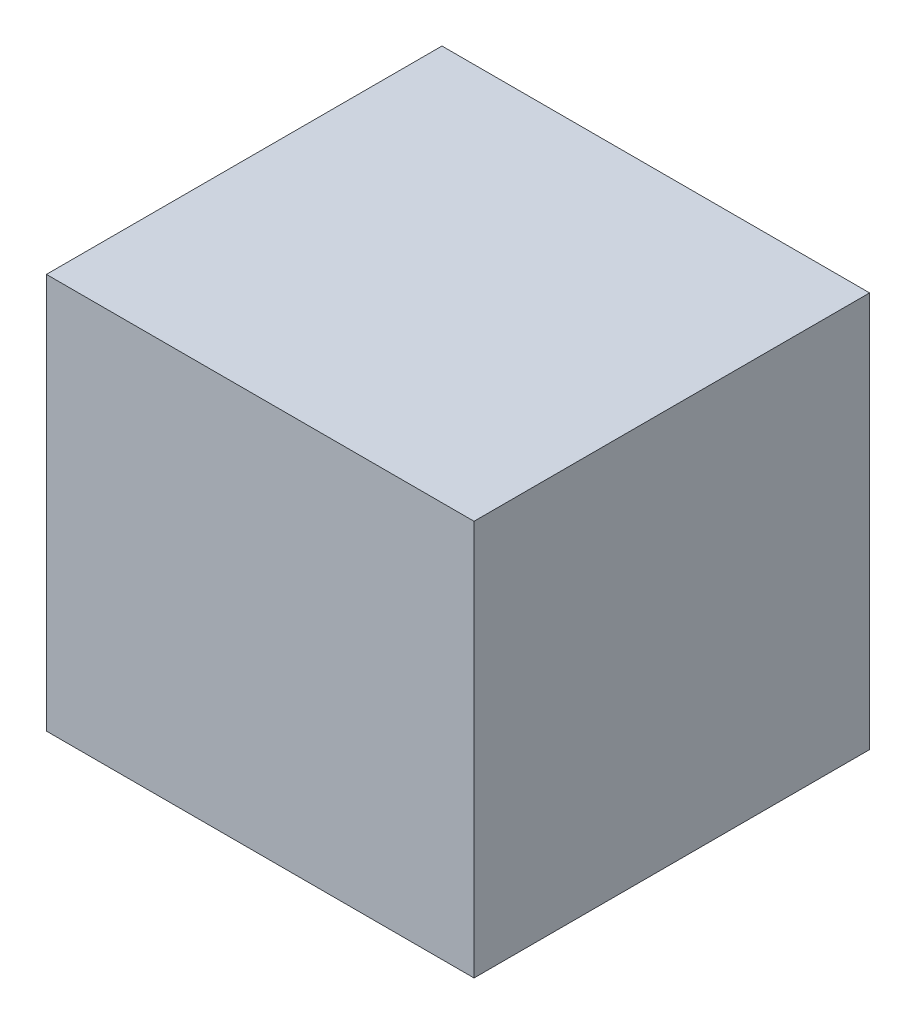
ISO-10303-21;
HEADER;
FILE_DESCRIPTION(('STEP AP214'),'2;1');
FILE_NAME('part.step','',(''),(''),'','','');
FILE_SCHEMA(('AUTOMOTIVE_DESIGN { 1 0 10303 214 1 1 1 1 }'));
ENDSEC;
DATA;
#1=APPLICATION_CONTEXT('core data for automotive mechanical design processes');
#2=APPLICATION_PROTOCOL_DEFINITION('international standard','automotive_design',2000,#1);
#3=PRODUCT_CONTEXT('',#1,'mechanical');
#4=PRODUCT('Part','Part','',(#3));
#5=PRODUCT_RELATED_PRODUCT_CATEGORY('part','',(#4));
#6=PRODUCT_DEFINITION_FORMATION('','',#4);
#7=PRODUCT_DEFINITION_CONTEXT('part definition',#1,'design');
#8=PRODUCT_DEFINITION('design','',#6,#7);
#9=PRODUCT_DEFINITION_SHAPE('','',#8);
#10=(LENGTH_UNIT() NAMED_UNIT(*) SI_UNIT(.MILLI.,.METRE.));
#11=(NAMED_UNIT(*) PLANE_ANGLE_UNIT() SI_UNIT($,.RADIAN.));
#12=(NAMED_UNIT(*) SI_UNIT($,.STERADIAN.) SOLID_ANGLE_UNIT());
#13=UNCERTAINTY_MEASURE_WITH_UNIT(LENGTH_MEASURE(1.E-05),#10,'distance_accuracy_value','');
#14=(GEOMETRIC_REPRESENTATION_CONTEXT(3) GLOBAL_UNCERTAINTY_ASSIGNED_CONTEXT((#13)) GLOBAL_UNIT_ASSIGNED_CONTEXT((#10,
#11,#12)) REPRESENTATION_CONTEXT('',''));
#15=CARTESIAN_POINT('',(0.,0.,0.));
#16=DIRECTION('',(0.,0.,1.));
#17=DIRECTION('',(1.,0.,0.));
#18=AXIS2_PLACEMENT_3D('',#15,#16,#17);
#19=CARTESIAN_POINT('',(8.,-18.5,-18.5));
#20=DIRECTION('',(-1.,0.,0.));
#21=DIRECTION('',(0.,0.,1.));
#22=AXIS2_PLACEMENT_3D('',#19,#20,#21);
#23=PLANE('',#22);
#24=DIRECTION('',(0.,-1.,0.));
#25=VECTOR('',#24,1.);
#26=CARTESIAN_POINT('',(8.,-18.5,18.5));
#27=LINE('',#26,#25);
#28=CARTESIAN_POINT('',(8.,18.5,18.5));
#29=VERTEX_POINT('',#28);
#30=CARTESIAN_POINT('',(8.,-18.5,18.5));
#31=VERTEX_POINT('',#30);
#32=EDGE_CURVE('E103',#29,#31,#27,.T.);
#33=ORIENTED_EDGE('',*,*,#32,.F.);
#34=DIRECTION('',(0.,0.,1.));
#35=VECTOR('',#34,1.);
#36=CARTESIAN_POINT('',(8.,18.5,-18.5));
#37=LINE('',#36,#35);
#38=CARTESIAN_POINT('',(8.,18.5,-18.5));
#39=VERTEX_POINT('',#38);
#40=EDGE_CURVE('E11',#39,#29,#37,.T.);
#41=ORIENTED_EDGE('',*,*,#40,.F.);
#42=DIRECTION('',(0.,-1.,0.));
#43=VECTOR('',#42,1.);
#44=CARTESIAN_POINT('',(8.,-18.5,-18.5));
#45=LINE('',#44,#43);
#46=CARTESIAN_POINT('',(8.,-18.5,-18.5));
#47=VERTEX_POINT('',#46);
#48=EDGE_CURVE('E97',#39,#47,#45,.T.);
#49=ORIENTED_EDGE('',*,*,#48,.T.);
#50=DIRECTION('',(0.,0.,1.));
#51=VECTOR('',#50,1.);
#52=CARTESIAN_POINT('',(8.,-18.5,-18.5));
#53=LINE('',#52,#51);
#54=EDGE_CURVE('E42',#47,#31,#53,.T.);
#55=ORIENTED_EDGE('',*,*,#54,.T.);
#56=EDGE_LOOP('',(#33,#41,#49,#55));
#57=FACE_BOUND('',#56,.T.);
#58=ADVANCED_FACE('F39',(#57),#23,.T.);
#59=CARTESIAN_POINT('',(8.,18.5,-18.5));
#60=DIRECTION('',(0.,1.,0.));
#61=DIRECTION('',(0.,0.,1.));
#62=AXIS2_PLACEMENT_3D('',#59,#60,#61);
#63=PLANE('',#62);
#64=DIRECTION('',(-1.,0.,0.));
#65=VECTOR('',#64,1.);
#66=CARTESIAN_POINT('',(8.,18.5,18.5));
#67=LINE('',#66,#65);
#68=CARTESIAN_POINT('',(48.,18.5,18.5));
#69=VERTEX_POINT('',#68);
#70=EDGE_CURVE('E99',#69,#29,#67,.T.);
#71=ORIENTED_EDGE('',*,*,#70,.F.);
#72=DIRECTION('',(0.,0.,1.));
#73=VECTOR('',#72,1.);
#74=CARTESIAN_POINT('',(48.,18.5,-18.5));
#75=LINE('',#74,#73);
#76=CARTESIAN_POINT('',(48.,18.5,-18.5));
#77=VERTEX_POINT('',#76);
#78=EDGE_CURVE('E48',#77,#69,#75,.T.);
#79=ORIENTED_EDGE('',*,*,#78,.F.);
#80=DIRECTION('',(-1.,0.,0.));
#81=VECTOR('',#80,1.);
#82=CARTESIAN_POINT('',(8.,18.5,-18.5));
#83=LINE('',#82,#81);
#84=EDGE_CURVE('E94',#77,#39,#83,.T.);
#85=ORIENTED_EDGE('',*,*,#84,.T.);
#86=ORIENTED_EDGE('',*,*,#40,.T.);
#87=EDGE_LOOP('',(#71,#79,#85,#86));
#88=FACE_BOUND('',#87,.T.);
#89=ADVANCED_FACE('F113',(#88),#63,.T.);
#90=CARTESIAN_POINT('',(48.,-18.5,-18.5));
#91=DIRECTION('',(1.,0.,0.));
#92=DIRECTION('',(0.,0.,-1.));
#93=AXIS2_PLACEMENT_3D('',#90,#91,#92);
#94=PLANE('',#93);
#95=DIRECTION('',(0.,1.,0.));
#96=VECTOR('',#95,1.);
#97=CARTESIAN_POINT('',(48.,-18.5,18.5));
#98=LINE('',#97,#96);
#99=CARTESIAN_POINT('',(48.,-18.5,18.5));
#100=VERTEX_POINT('',#99);
#101=EDGE_CURVE('E89',#100,#69,#98,.T.);
#102=ORIENTED_EDGE('',*,*,#101,.F.);
#103=DIRECTION('',(0.,0.,1.));
#104=VECTOR('',#103,1.);
#105=CARTESIAN_POINT('',(48.,-18.5,-18.5));
#106=LINE('',#105,#104);
#107=CARTESIAN_POINT('',(48.,-18.5,-18.5));
#108=VERTEX_POINT('',#107);
#109=EDGE_CURVE('E84',#108,#100,#106,.T.);
#110=ORIENTED_EDGE('',*,*,#109,.F.);
#111=DIRECTION('',(0.,1.,0.));
#112=VECTOR('',#111,1.);
#113=CARTESIAN_POINT('',(48.,-18.5,-18.5));
#114=LINE('',#113,#112);
#115=EDGE_CURVE('E87',#108,#77,#114,.T.);
#116=ORIENTED_EDGE('',*,*,#115,.T.);
#117=ORIENTED_EDGE('',*,*,#78,.T.);
#118=EDGE_LOOP('',(#102,#110,#116,#117));
#119=FACE_BOUND('',#118,.T.);
#120=ADVANCED_FACE('F86',(#119),#94,.T.);
#121=CARTESIAN_POINT('',(8.,-18.5,-18.5));
#122=DIRECTION('',(0.,-1.,0.));
#123=DIRECTION('',(0.,0.,-1.));
#124=AXIS2_PLACEMENT_3D('',#121,#122,#123);
#125=PLANE('',#124);
#126=DIRECTION('',(1.,0.,0.));
#127=VECTOR('',#126,1.);
#128=CARTESIAN_POINT('',(8.,-18.5,18.5));
#129=LINE('',#128,#127);
#130=EDGE_CURVE('E106',#31,#100,#129,.T.);
#131=ORIENTED_EDGE('',*,*,#130,.F.);
#132=ORIENTED_EDGE('',*,*,#54,.F.);
#133=DIRECTION('',(1.,0.,0.));
#134=VECTOR('',#133,1.);
#135=CARTESIAN_POINT('',(8.,-18.5,-18.5));
#136=LINE('',#135,#134);
#137=EDGE_CURVE('E93',#47,#108,#136,.T.);
#138=ORIENTED_EDGE('',*,*,#137,.T.);
#139=ORIENTED_EDGE('',*,*,#109,.T.);
#140=EDGE_LOOP('',(#131,#132,#138,#139));
#141=FACE_BOUND('',#140,.T.);
#142=ADVANCED_FACE('F96',(#141),#125,.T.);
#143=CARTESIAN_POINT('',(0.,0.,-18.5));
#144=DIRECTION('',(0.,0.,-1.));
#145=DIRECTION('',(-1.,0.,0.));
#146=AXIS2_PLACEMENT_3D('',#143,#144,#145);
#147=PLANE('',#146);
#148=ORIENTED_EDGE('',*,*,#48,.F.);
#149=ORIENTED_EDGE('',*,*,#84,.F.);
#150=ORIENTED_EDGE('',*,*,#115,.F.);
#151=ORIENTED_EDGE('',*,*,#137,.F.);
#152=EDGE_LOOP('',(#148,#149,#150,#151));
#153=FACE_BOUND('',#152,.T.);
#154=ADVANCED_FACE('F92',(#153),#147,.T.);
#155=CARTESIAN_POINT('',(0.,0.,18.5));
#156=DIRECTION('',(0.,0.,-1.));
#157=DIRECTION('',(-1.,0.,0.));
#158=AXIS2_PLACEMENT_3D('',#155,#156,#157);
#159=PLANE('',#158);
#160=ORIENTED_EDGE('',*,*,#32,.T.);
#161=ORIENTED_EDGE('',*,*,#130,.T.);
#162=ORIENTED_EDGE('',*,*,#101,.T.);
#163=ORIENTED_EDGE('',*,*,#70,.T.);
#164=EDGE_LOOP('',(#160,#161,#162,#163));
#165=FACE_BOUND('',#164,.T.);
#166=ADVANCED_FACE('F112',(#165),#159,.F.);
#167=CLOSED_SHELL('',(#58,#89,#120,#142,#154,#166));
#168=MANIFOLD_SOLID_BREP('B2',#167);
#169=ADVANCED_BREP_SHAPE_REPRESENTATION('',(#18,#168),#14);
#170=SHAPE_DEFINITION_REPRESENTATION(#9,#169);
ENDSEC;
END-ISO-10303-21;
